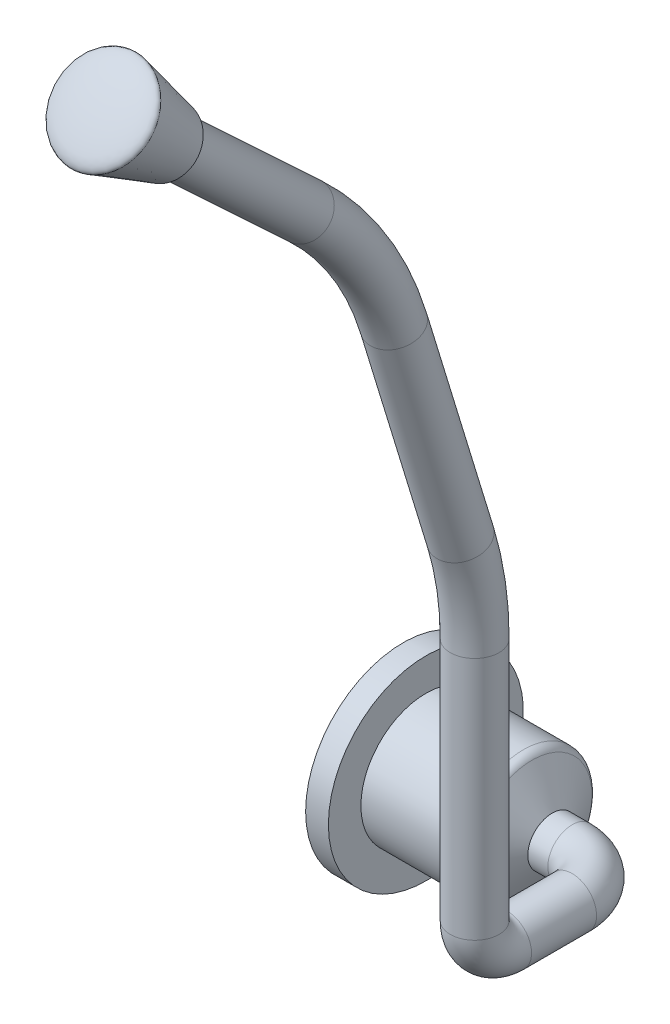
ISO-10303-21;
HEADER;
FILE_DESCRIPTION(('STEP AP214'),'2;1');
FILE_NAME('part.step','',(''),(''),'','','');
FILE_SCHEMA(('AUTOMOTIVE_DESIGN { 1 0 10303 214 1 1 1 1 }'));
ENDSEC;
DATA;
#1=APPLICATION_CONTEXT('core data for automotive mechanical design processes');
#2=APPLICATION_PROTOCOL_DEFINITION('international standard','automotive_design',2000,#1);
#3=PRODUCT_CONTEXT('',#1,'mechanical');
#4=PRODUCT('Part','Part','',(#3));
#5=PRODUCT_RELATED_PRODUCT_CATEGORY('part','',(#4));
#6=PRODUCT_DEFINITION_FORMATION('','',#4);
#7=PRODUCT_DEFINITION_CONTEXT('part definition',#1,'design');
#8=PRODUCT_DEFINITION('design','',#6,#7);
#9=PRODUCT_DEFINITION_SHAPE('','',#8);
#10=(LENGTH_UNIT() NAMED_UNIT(*) SI_UNIT(.MILLI.,.METRE.));
#11=(NAMED_UNIT(*) PLANE_ANGLE_UNIT() SI_UNIT($,.RADIAN.));
#12=(NAMED_UNIT(*) SI_UNIT($,.STERADIAN.) SOLID_ANGLE_UNIT());
#13=UNCERTAINTY_MEASURE_WITH_UNIT(LENGTH_MEASURE(1.E-05),#10,'distance_accuracy_value','');
#14=(GEOMETRIC_REPRESENTATION_CONTEXT(3) GLOBAL_UNCERTAINTY_ASSIGNED_CONTEXT((#13)) GLOBAL_UNIT_ASSIGNED_CONTEXT((#10,
#11,#12)) REPRESENTATION_CONTEXT('',''));
#15=CARTESIAN_POINT('',(0.,0.,0.));
#16=DIRECTION('',(0.,0.,1.));
#17=DIRECTION('',(1.,0.,0.));
#18=AXIS2_PLACEMENT_3D('',#15,#16,#17);
#19=CARTESIAN_POINT('',(0.,265.,125.));
#20=DIRECTION('',(0.,-0.681998360062496,-0.731353701619173));
#21=DIRECTION('',(0.,0.731353701619173,-0.681998360062496));
#22=AXIS2_PLACEMENT_3D('',#19,#20,#21);
#23=CYLINDRICAL_SURFACE('',#22,7.5);
#24=CARTESIAN_POINT('',(0.,225.150071261708,82.266183324342));
#25=DIRECTION('',(0.,0.681998360062496,0.731353701619173));
#26=DIRECTION('',(1.,0.,0.));
#27=AXIS2_PLACEMENT_3D('',#24,#25,#26);
#28=CIRCLE('',#27,7.5);
#29=CARTESIAN_POINT('',(0.,230.635224023852,77.1511956238733));
#30=VERTEX_POINT('',#29);
#31=EDGE_CURVE('E69',#30,#30,#28,.T.);
#32=ORIENTED_EDGE('',*,*,#31,.T.);
#33=EDGE_LOOP('',(#32));
#34=FACE_BOUND('',#33,.T.);
#35=CARTESIAN_POINT('',(0.,265.,125.));
#36=DIRECTION('',(0.,0.681998360062496,0.731353701619173));
#37=DIRECTION('',(1.,0.,0.));
#38=AXIS2_PLACEMENT_3D('',#35,#36,#37);
#39=CIRCLE('',#38,7.5);
#40=CARTESIAN_POINT('',(7.5,265.,125.));
#41=VERTEX_POINT('',#40);
#42=EDGE_CURVE('E63',#41,#41,#39,.T.);
#43=ORIENTED_EDGE('',*,*,#42,.F.);
#44=EDGE_LOOP('',(#43));
#45=FACE_BOUND('',#44,.T.);
#46=ADVANCED_FACE('F41',(#34,#45),#23,.T.);
#47=CARTESIAN_POINT('',(0.,152.014701099791,150.466019330592));
#48=DIRECTION('',(-1.,0.,0.));
#49=DIRECTION('',(0.,0.,1.));
#50=AXIS2_PLACEMENT_3D('',#47,#48,#49);
#51=TOROIDAL_SURFACE('',#50,100.,7.5);
#52=CARTESIAN_POINT('',(0.,181.251871572065,54.8355437342881));
#53=DIRECTION('',(0.,0.956304755963035,0.292371704722737));
#54=DIRECTION('',(1.,0.,0.));
#55=AXIS2_PLACEMENT_3D('',#52,#53,#54);
#56=CIRCLE('',#55,7.5);
#57=CARTESIAN_POINT('',(0.,183.444659357485,47.6632580645654));
#58=VERTEX_POINT('',#57);
#59=EDGE_CURVE('E79',#58,#58,#56,.T.);
#60=CARTESIAN_POINT('',(0.,152.014701099791,150.466019330592));
#61=DIRECTION('',(-1.,0.,0.));
#62=DIRECTION('',(0.,0.,1.));
#63=AXIS2_PLACEMENT_3D('',#60,#61,#62);
#64=CIRCLE('',#63,107.5);
#65=EDGE_CURVE('',#30,#58,#64,.T.);
#66=ORIENTED_EDGE('',*,*,#31,.F.);
#67=ORIENTED_EDGE('',*,*,#59,.T.);
#68=ORIENTED_EDGE('',*,*,#65,.T.);
#69=ORIENTED_EDGE('',*,*,#65,.F.);
#70=EDGE_LOOP('',(#66,#68,#67,#69));
#71=FACE_BOUND('',#70,.T.);
#72=ADVANCED_FACE('F130',(#71),#51,.T.);
#73=CARTESIAN_POINT('',(0.,181.251871572065,54.8355437342881));
#74=DIRECTION('',(0.,-0.956304755963035,-0.292371704722737));
#75=DIRECTION('',(0.,0.292371704722737,-0.956304755963035));
#76=AXIS2_PLACEMENT_3D('',#73,#74,#75);
#77=CYLINDRICAL_SURFACE('',#76,7.5);
#78=CARTESIAN_POINT('',(0.,114.310538654652,34.3695244036965));
#79=DIRECTION('',(0.,0.956304755963035,0.292371704722737));
#80=DIRECTION('',(1.,0.,0.));
#81=AXIS2_PLACEMENT_3D('',#78,#79,#80);
#82=CIRCLE('',#81,7.5);
#83=CARTESIAN_POINT('',(0.,116.503326440073,27.1972387339737));
#84=VERTEX_POINT('',#83);
#85=EDGE_CURVE('E83',#84,#84,#82,.T.);
#86=ORIENTED_EDGE('',*,*,#85,.T.);
#87=EDGE_LOOP('',(#86));
#88=FACE_BOUND('',#87,.T.);
#89=ORIENTED_EDGE('',*,*,#59,.F.);
#90=EDGE_LOOP('',(#89));
#91=FACE_BOUND('',#90,.T.);
#92=ADVANCED_FACE('F134',(#88,#91),#77,.T.);
#93=CARTESIAN_POINT('',(0.,85.0733681823783,130.));
#94=DIRECTION('',(-1.,0.,0.));
#95=DIRECTION('',(0.,0.,1.));
#96=AXIS2_PLACEMENT_3D('',#93,#94,#95);
#97=TOROIDAL_SURFACE('',#96,100.,7.5);
#98=CARTESIAN_POINT('',(0.,85.0733681823783,30.));
#99=DIRECTION('',(0.,1.,0.));
#100=DIRECTION('',(1.,0.,0.));
#101=AXIS2_PLACEMENT_3D('',#98,#99,#100);
#102=CIRCLE('',#101,7.5);
#103=CARTESIAN_POINT('',(0.,85.0733681823783,22.5));
#104=VERTEX_POINT('',#103);
#105=EDGE_CURVE('E87',#104,#104,#102,.T.);
#106=CARTESIAN_POINT('',(0.,85.0733681823783,130.));
#107=DIRECTION('',(-1.,0.,0.));
#108=DIRECTION('',(0.,0.,1.));
#109=AXIS2_PLACEMENT_3D('',#106,#107,#108);
#110=CIRCLE('',#109,107.5);
#111=EDGE_CURVE('',#84,#104,#110,.T.);
#112=ORIENTED_EDGE('',*,*,#85,.F.);
#113=ORIENTED_EDGE('',*,*,#105,.T.);
#114=ORIENTED_EDGE('',*,*,#111,.T.);
#115=ORIENTED_EDGE('',*,*,#111,.F.);
#116=EDGE_LOOP('',(#112,#114,#113,#115));
#117=FACE_BOUND('',#116,.T.);
#118=ADVANCED_FACE('F138',(#117),#97,.T.);
#119=CARTESIAN_POINT('',(0.,85.0733681823783,30.));
#120=DIRECTION('',(0.,-1.,0.));
#121=DIRECTION('',(0.,0.,-1.));
#122=AXIS2_PLACEMENT_3D('',#119,#120,#121);
#123=CYLINDRICAL_SURFACE('',#122,7.5);
#124=CARTESIAN_POINT('',(0.,9.99999999999999,30.));
#125=DIRECTION('',(0.,1.,0.));
#126=DIRECTION('',(1.,0.,0.));
#127=AXIS2_PLACEMENT_3D('',#124,#125,#126);
#128=CIRCLE('',#127,7.5);
#129=CARTESIAN_POINT('',(0.,9.99999999999999,37.5));
#130=VERTEX_POINT('',#129);
#131=EDGE_CURVE('E91',#130,#130,#128,.T.);
#132=ORIENTED_EDGE('',*,*,#131,.T.);
#133=EDGE_LOOP('',(#132));
#134=FACE_BOUND('',#133,.T.);
#135=ORIENTED_EDGE('',*,*,#105,.F.);
#136=EDGE_LOOP('',(#135));
#137=FACE_BOUND('',#136,.T.);
#138=ADVANCED_FACE('F108',(#134,#137),#123,.T.);
#139=CARTESIAN_POINT('',(0.,10.,20.));
#140=DIRECTION('',(1.,0.,0.));
#141=DIRECTION('',(0.,0.,-1.));
#142=AXIS2_PLACEMENT_3D('',#139,#140,#141);
#143=TOROIDAL_SURFACE('',#142,10.,7.5);
#144=CARTESIAN_POINT('',(0.,0.,20.));
#145=DIRECTION('',(0.,0.,1.));
#146=DIRECTION('',(1.,0.,0.));
#147=AXIS2_PLACEMENT_3D('',#144,#145,#146);
#148=CIRCLE('',#147,7.5);
#149=CARTESIAN_POINT('',(0.,-7.5,20.));
#150=VERTEX_POINT('',#149);
#151=EDGE_CURVE('E49',#150,#150,#148,.T.);
#152=CARTESIAN_POINT('',(0.,10.,20.));
#153=DIRECTION('',(1.,0.,0.));
#154=DIRECTION('',(0.,0.,-1.));
#155=AXIS2_PLACEMENT_3D('',#152,#153,#154);
#156=CIRCLE('',#155,17.5);
#157=EDGE_CURVE('',#130,#150,#156,.T.);
#158=ORIENTED_EDGE('',*,*,#131,.F.);
#159=ORIENTED_EDGE('',*,*,#151,.T.);
#160=ORIENTED_EDGE('',*,*,#157,.T.);
#161=ORIENTED_EDGE('',*,*,#157,.F.);
#162=EDGE_LOOP('',(#158,#160,#159,#161));
#163=FACE_BOUND('',#162,.T.);
#164=ADVANCED_FACE('F98',(#163),#143,.T.);
#165=CARTESIAN_POINT('',(0.,0.,20.));
#166=DIRECTION('',(0.,0.,-1.));
#167=DIRECTION('',(-1.,0.,0.));
#168=AXIS2_PLACEMENT_3D('',#165,#166,#167);
#169=CYLINDRICAL_SURFACE('',#168,7.5);
#170=CARTESIAN_POINT('',(0.,0.,0.));
#171=DIRECTION('',(0.,0.,-1.));
#172=DIRECTION('',(-1.,0.,0.));
#173=AXIS2_PLACEMENT_3D('',#170,#171,#172);
#174=CIRCLE('',#173,7.5);
#175=CARTESIAN_POINT('',(7.49999999999999,0.,0.));
#176=VERTEX_POINT('',#175);
#177=EDGE_CURVE('E111',#176,#176,#174,.T.);
#178=ORIENTED_EDGE('',*,*,#177,.F.);
#179=EDGE_LOOP('',(#178));
#180=FACE_BOUND('',#179,.T.);
#181=ORIENTED_EDGE('',*,*,#151,.F.);
#182=EDGE_LOOP('',(#181));
#183=FACE_BOUND('',#182,.T.);
#184=ADVANCED_FACE('F43',(#180,#183),#169,.T.);
#185=CARTESIAN_POINT('',(0.,265.,125.));
#186=DIRECTION('',(0.,0.681998360062495,0.731353701619174));
#187=DIRECTION('',(0.,-0.731353701619174,0.681998360062495));
#188=AXIS2_PLACEMENT_3D('',#185,#186,#187);
#189=CONICAL_SURFACE('',#188,9.4999999999999,0.189679565920707);
#190=CARTESIAN_POINT('',(0.,282.824967853028,144.114937782784));
#191=DIRECTION('',(0.,-0.681998360062495,-0.731353701619174));
#192=DIRECTION('',(0.,0.731353701619174,-0.681998360062495));
#193=AXIS2_PLACEMENT_3D('',#190,#191,#192);
#194=CIRCLE('',#193,14.5178600136778);
#195=CARTESIAN_POINT('',(0.,293.442658513621,134.213781061839));
#196=VERTEX_POINT('',#195);
#197=EDGE_CURVE('E60',#196,#196,#194,.T.);
#198=ORIENTED_EDGE('',*,*,#197,.T.);
#199=EDGE_LOOP('',(#198));
#200=FACE_BOUND('',#199,.T.);
#201=CARTESIAN_POINT('',(0.,265.,125.));
#202=DIRECTION('',(0.,-0.681998360062495,-0.731353701619174));
#203=DIRECTION('',(0.,0.731353701619174,-0.681998360062495));
#204=AXIS2_PLACEMENT_3D('',#201,#202,#203);
#205=CIRCLE('',#204,9.49999999999993);
#206=CARTESIAN_POINT('',(0.,271.947860165382,118.521015579406));
#207=VERTEX_POINT('',#206);
#208=EDGE_CURVE('E64',#207,#207,#205,.T.);
#209=ORIENTED_EDGE('',*,*,#208,.F.);
#210=EDGE_LOOP('',(#209));
#211=FACE_BOUND('',#210,.T.);
#212=ADVANCED_FACE('F56',(#200,#211),#189,.T.);
#213=CARTESIAN_POINT('',(0.,282.824967853028,144.114937782784));
#214=DIRECTION('',(1.,0.,0.));
#215=DIRECTION('',(0.,-0.731353701619172,0.681998360062497));
#216=AXIS2_PLACEMENT_3D('',#213,#214,#215);
#217=ELLIPSE('',#216,14.5178600136777,3.86362065240913);
#218=TRIMMED_CURVE('',#217,(PARAMETER_VALUE(1.57079632679489)),
(PARAMETER_VALUE(4.71238898038469)),.T.,.PARAMETER.);
#219=CARTESIAN_POINT('',(0.,265.,125.));
#220=DIRECTION('',(0.,-0.681998360062495,-0.731353701619174));
#221=AXIS1_PLACEMENT('',#219,#220);
#222=SURFACE_OF_REVOLUTION('',#218,#221);
#223=CARTESIAN_POINT('',(0.,285.459950801875,146.940611048575));
#224=VERTEX_POINT('',#223);
#225=VERTEX_LOOP('',#224);
#226=FACE_BOUND('',#225,.T.);
#227=ORIENTED_EDGE('',*,*,#197,.F.);
#228=EDGE_LOOP('',(#227));
#229=FACE_BOUND('',#228,.T.);
#230=ADVANCED_FACE('F52',(#226,#229),#222,.F.);
#231=CARTESIAN_POINT('',(0.,185.605020370141,199.037016268435));
#232=DIRECTION('',(0.,-0.681998360062495,-0.731353701619174));
#233=DIRECTION('',(0.,0.731353701619174,-0.681998360062495));
#234=AXIS2_PLACEMENT_3D('',#231,#232,#233);
#235=PLANE('',#234);
#236=ORIENTED_EDGE('',*,*,#42,.T.);
#237=EDGE_LOOP('',(#236));
#238=FACE_BOUND('',#237,.T.);
#239=ORIENTED_EDGE('',*,*,#208,.T.);
#240=EDGE_LOOP('',(#239));
#241=FACE_BOUND('',#240,.T.);
#242=ADVANCED_FACE('F55',(#238,#241),#235,.T.);
#243=CARTESIAN_POINT('',(-13.,0.,0.));
#244=DIRECTION('',(0.,1.,0.));
#245=DIRECTION('',(0.,0.,1.));
#246=AXIS2_PLACEMENT_3D('',#243,#244,#245);
#247=TOROIDAL_SURFACE('',#246,13.,7.5);
#248=CARTESIAN_POINT('',(-13.,0.,-13.));
#249=DIRECTION('',(-1.,0.,0.));
#250=DIRECTION('',(0.,0.,1.));
#251=AXIS2_PLACEMENT_3D('',#248,#249,#250);
#252=CIRCLE('',#251,7.5);
#253=CARTESIAN_POINT('',(-13.,0.,-20.5));
#254=VERTEX_POINT('',#253);
#255=EDGE_CURVE('E72',#254,#254,#252,.T.);
#256=CARTESIAN_POINT('',(-13.,0.,0.));
#257=DIRECTION('',(0.,1.,0.));
#258=DIRECTION('',(0.,0.,1.));
#259=AXIS2_PLACEMENT_3D('',#256,#257,#258);
#260=CIRCLE('',#259,20.5);
#261=EDGE_CURVE('',#176,#254,#260,.T.);
#262=ORIENTED_EDGE('',*,*,#177,.T.);
#263=ORIENTED_EDGE('',*,*,#255,.F.);
#264=ORIENTED_EDGE('',*,*,#261,.T.);
#265=ORIENTED_EDGE('',*,*,#261,.F.);
#266=EDGE_LOOP('',(#262,#264,#263,#265));
#267=FACE_BOUND('',#266,.T.);
#268=ADVANCED_FACE('F161',(#267),#247,.T.);
#269=CARTESIAN_POINT('',(-13.,0.,-13.));
#270=DIRECTION('',(-1.,0.,0.));
#271=DIRECTION('',(0.,0.,1.));
#272=AXIS2_PLACEMENT_3D('',#269,#270,#271);
#273=CYLINDRICAL_SURFACE('',#272,7.5);
#274=CARTESIAN_POINT('',(-19.1595187437014,0.,-13.));
#275=DIRECTION('',(-1.,0.,0.));
#276=DIRECTION('',(0.,0.,1.));
#277=AXIS2_PLACEMENT_3D('',#274,#275,#276);
#278=CIRCLE('',#277,7.5);
#279=CARTESIAN_POINT('',(-19.1595187437014,0.,-5.49999999999999));
#280=VERTEX_POINT('',#279);
#281=EDGE_CURVE('E11',#280,#280,#278,.T.);
#282=ORIENTED_EDGE('',*,*,#281,.F.);
#283=EDGE_LOOP('',(#282));
#284=FACE_BOUND('',#283,.T.);
#285=ORIENTED_EDGE('',*,*,#255,.T.);
#286=EDGE_LOOP('',(#285));
#287=FACE_BOUND('',#286,.T.);
#288=ADVANCED_FACE('F162',(#284,#287),#273,.T.);
#289=CARTESIAN_POINT('',(-28.,0.,-13.));
#290=DIRECTION('',(-1.,0.,0.));
#291=DIRECTION('',(0.,0.,1.));
#292=AXIS2_PLACEMENT_3D('',#289,#290,#291);
#293=TOROIDAL_SURFACE('',#292,17.,2.99999999999999);
#294=CARTESIAN_POINT('',(-25.390847210375,0.,-13.));
#295=DIRECTION('',(-1.,0.,0.));
#296=DIRECTION('',(0.,0.,1.));
#297=AXIS2_PLACEMENT_3D('',#294,#295,#296);
#298=CIRCLE('',#297,18.4806490875262);
#299=CARTESIAN_POINT('',(-25.390847210375,0.,5.4806490875262));
#300=VERTEX_POINT('',#299);
#301=EDGE_CURVE('E205',#300,#300,#298,.T.);
#302=ORIENTED_EDGE('',*,*,#301,.T.);
#303=EDGE_LOOP('',(#302));
#304=FACE_BOUND('',#303,.T.);
#305=CARTESIAN_POINT('',(-28.,0.,-13.));
#306=DIRECTION('',(-1.,0.,0.));
#307=DIRECTION('',(0.,0.,1.));
#308=AXIS2_PLACEMENT_3D('',#305,#306,#307);
#309=CIRCLE('',#308,20.);
#310=CARTESIAN_POINT('',(-28.,0.,7.00000000000001));
#311=VERTEX_POINT('',#310);
#312=EDGE_CURVE('E114',#311,#311,#309,.T.);
#313=ORIENTED_EDGE('',*,*,#312,.F.);
#314=EDGE_LOOP('',(#313));
#315=FACE_BOUND('',#314,.T.);
#316=ADVANCED_FACE('F170',(#304,#315),#293,.T.);
#317=CARTESIAN_POINT('',(-58.,0.,-13.));
#318=DIRECTION('',(-1.,0.,0.));
#319=DIRECTION('',(0.,0.,1.));
#320=AXIS2_PLACEMENT_3D('',#317,#318,#319);
#321=CYLINDRICAL_SURFACE('',#320,20.);
#322=ORIENTED_EDGE('',*,*,#312,.T.);
#323=EDGE_LOOP('',(#322));
#324=FACE_BOUND('',#323,.T.);
#325=CARTESIAN_POINT('',(-58.,0.,-13.));
#326=DIRECTION('',(-1.,0.,0.));
#327=DIRECTION('',(0.,0.,1.));
#328=AXIS2_PLACEMENT_3D('',#325,#326,#327);
#329=CIRCLE('',#328,20.);
#330=CARTESIAN_POINT('',(-58.,0.,7.00000000000001));
#331=VERTEX_POINT('',#330);
#332=EDGE_CURVE('E121',#331,#331,#329,.T.);
#333=ORIENTED_EDGE('',*,*,#332,.F.);
#334=EDGE_LOOP('',(#333));
#335=FACE_BOUND('',#334,.T.);
#336=ADVANCED_FACE('F176',(#324,#335),#321,.T.);
#337=CARTESIAN_POINT('',(-58.,0.,0.));
#338=DIRECTION('',(-1.,0.,0.));
#339=DIRECTION('',(0.,0.,1.));
#340=AXIS2_PLACEMENT_3D('',#337,#338,#339);
#341=PLANE('',#340);
#342=CARTESIAN_POINT('',(-58.,0.,-13.));
#343=DIRECTION('',(-1.,0.,0.));
#344=DIRECTION('',(0.,0.,1.));
#345=AXIS2_PLACEMENT_3D('',#342,#343,#344);
#346=CIRCLE('',#345,30.);
#347=CARTESIAN_POINT('',(-58.,0.,17.));
#348=VERTEX_POINT('',#347);
#349=EDGE_CURVE('E211',#348,#348,#346,.T.);
#350=ORIENTED_EDGE('',*,*,#349,.F.);
#351=EDGE_LOOP('',(#350));
#352=FACE_BOUND('',#351,.T.);
#353=ORIENTED_EDGE('',*,*,#332,.T.);
#354=EDGE_LOOP('',(#353));
#355=FACE_BOUND('',#354,.T.);
#356=ADVANCED_FACE('F184',(#352,#355),#341,.F.);
#357=CARTESIAN_POINT('',(-58.,0.,-13.));
#358=DIRECTION('',(-1.,0.,0.));
#359=DIRECTION('',(0.,0.,1.));
#360=AXIS2_PLACEMENT_3D('',#357,#358,#359);
#361=CYLINDRICAL_SURFACE('',#360,30.);
#362=CARTESIAN_POINT('',(-65.,0.,-13.));
#363=DIRECTION('',(-1.,0.,0.));
#364=DIRECTION('',(0.,0.,1.));
#365=AXIS2_PLACEMENT_3D('',#362,#363,#364);
#366=CIRCLE('',#365,30.);
#367=CARTESIAN_POINT('',(-65.,0.,17.));
#368=VERTEX_POINT('',#367);
#369=EDGE_CURVE('E207',#368,#368,#366,.T.);
#370=ORIENTED_EDGE('',*,*,#369,.F.);
#371=EDGE_LOOP('',(#370));
#372=FACE_BOUND('',#371,.T.);
#373=ORIENTED_EDGE('',*,*,#349,.T.);
#374=EDGE_LOOP('',(#373));
#375=FACE_BOUND('',#374,.T.);
#376=ADVANCED_FACE('F188',(#372,#375),#361,.T.);
#377=CARTESIAN_POINT('',(-65.,0.,0.));
#378=DIRECTION('',(-1.,0.,0.));
#379=DIRECTION('',(0.,0.,1.));
#380=AXIS2_PLACEMENT_3D('',#377,#378,#379);
#381=PLANE('',#380);
#382=ORIENTED_EDGE('',*,*,#369,.T.);
#383=EDGE_LOOP('',(#382));
#384=FACE_BOUND('',#383,.T.);
#385=ADVANCED_FACE('F192',(#384),#381,.T.);
#386=CARTESIAN_POINT('',(-25.390847210375,0.,-13.));
#387=DIRECTION('',(-1.,0.,0.));
#388=DIRECTION('',(0.,0.,1.));
#389=AXIS2_PLACEMENT_3D('',#386,#387,#388);
#390=CONICAL_SURFACE('',#389,18.4806490875262,1.05462984326328);
#391=ORIENTED_EDGE('',*,*,#281,.T.);
#392=EDGE_LOOP('',(#391));
#393=FACE_BOUND('',#392,.T.);
#394=ORIENTED_EDGE('',*,*,#301,.F.);
#395=EDGE_LOOP('',(#394));
#396=FACE_BOUND('',#395,.T.);
#397=ADVANCED_FACE('F196',(#393,#396),#390,.T.);
#398=CLOSED_SHELL('',(#46,#72,#92,#118,#138,#164,#184,#212,#230,#242,#268,#288,#316,#336,#356,
#376,#385,#397));
#399=MANIFOLD_SOLID_BREP('B2',#398);
#400=ADVANCED_BREP_SHAPE_REPRESENTATION('',(#18,#399),#14);
#401=SHAPE_DEFINITION_REPRESENTATION(#9,#400);
ENDSEC;
END-ISO-10303-21;
